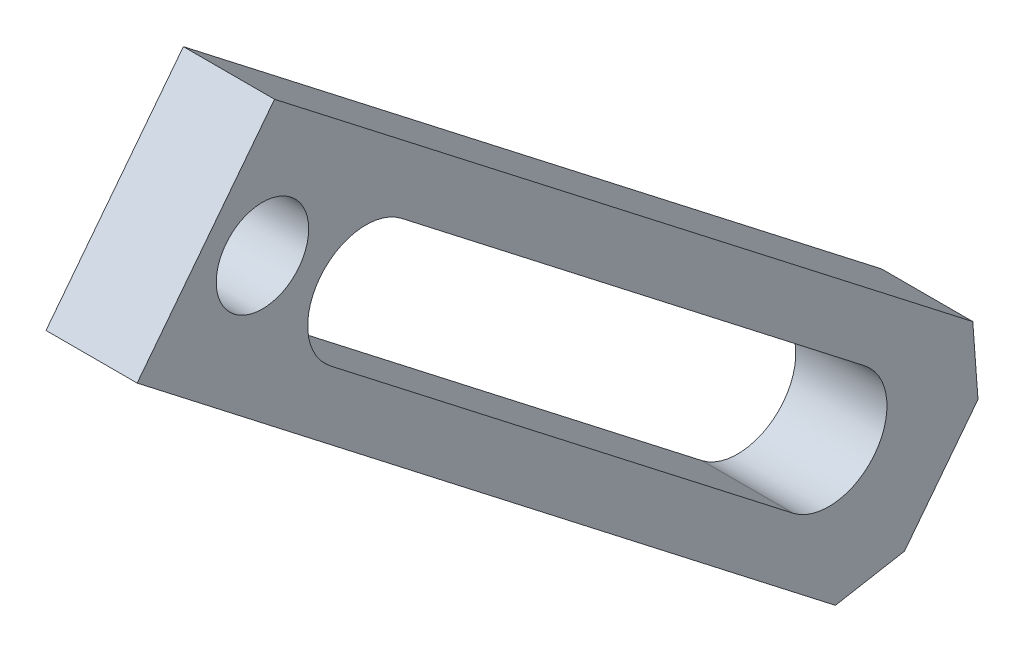
ISO-10303-21;
HEADER;
FILE_DESCRIPTION(('STEP AP214'),'2;1');
FILE_NAME('part.step','',(''),(''),'','','');
FILE_SCHEMA(('AUTOMOTIVE_DESIGN { 1 0 10303 214 1 1 1 1 }'));
ENDSEC;
DATA;
#1=APPLICATION_CONTEXT('core data for automotive mechanical design processes');
#2=APPLICATION_PROTOCOL_DEFINITION('international standard','automotive_design',2000,#1);
#3=PRODUCT_CONTEXT('',#1,'mechanical');
#4=PRODUCT('Part','Part','',(#3));
#5=PRODUCT_RELATED_PRODUCT_CATEGORY('part','',(#4));
#6=PRODUCT_DEFINITION_FORMATION('','',#4);
#7=PRODUCT_DEFINITION_CONTEXT('part definition',#1,'design');
#8=PRODUCT_DEFINITION('design','',#6,#7);
#9=PRODUCT_DEFINITION_SHAPE('','',#8);
#10=(LENGTH_UNIT() NAMED_UNIT(*) SI_UNIT(.MILLI.,.METRE.));
#11=(NAMED_UNIT(*) PLANE_ANGLE_UNIT() SI_UNIT($,.RADIAN.));
#12=(NAMED_UNIT(*) SI_UNIT($,.STERADIAN.) SOLID_ANGLE_UNIT());
#13=UNCERTAINTY_MEASURE_WITH_UNIT(LENGTH_MEASURE(1.E-05),#10,'distance_accuracy_value','');
#14=(GEOMETRIC_REPRESENTATION_CONTEXT(3) GLOBAL_UNCERTAINTY_ASSIGNED_CONTEXT((#13)) GLOBAL_UNIT_ASSIGNED_CONTEXT((#10,
#11,#12)) REPRESENTATION_CONTEXT('',''));
#15=CARTESIAN_POINT('',(0.,0.,0.));
#16=DIRECTION('',(0.,0.,1.));
#17=DIRECTION('',(1.,0.,0.));
#18=AXIS2_PLACEMENT_3D('',#15,#16,#17);
#19=CARTESIAN_POINT('',(-15.972282,3.542538,-376.003566));
#20=DIRECTION('',(0.,-0.790155249608492,0.612906747814169));
#21=DIRECTION('',(0.,-0.612906747814169,-0.790155249608492));
#22=AXIS2_PLACEMENT_3D('',#19,#20,#21);
#23=PLANE('',#22);
#24=DIRECTION('',(0.,-0.612906747814169,-0.790155249608492));
#25=VECTOR('',#24,1.);
#26=CARTESIAN_POINT('',(0.,3.542538,-376.003566));
#27=LINE('',#26,#25);
#28=CARTESIAN_POINT('',(0.,98.434652,-253.669292));
#29=VERTEX_POINT('',#28);
#30=CARTESIAN_POINT('',(0.,3.542538,-376.003566));
#31=VERTEX_POINT('',#30);
#32=EDGE_CURVE('E153',#29,#31,#27,.T.);
#33=ORIENTED_EDGE('',*,*,#32,.F.);
#34=DIRECTION('',(1.,0.,0.));
#35=VECTOR('',#34,1.);
#36=CARTESIAN_POINT('',(-15.972282,98.434652,-253.669292));
#37=LINE('',#36,#35);
#38=CARTESIAN_POINT('',(-15.972282,98.434652,-253.669292));
#39=VERTEX_POINT('',#38);
#40=EDGE_CURVE('E11',#39,#29,#37,.T.);
#41=ORIENTED_EDGE('',*,*,#40,.F.);
#42=DIRECTION('',(0.,-0.612906747814169,-0.790155249608492));
#43=VECTOR('',#42,1.);
#44=CARTESIAN_POINT('',(-15.972282,3.542538,-376.003566));
#45=LINE('',#44,#43);
#46=CARTESIAN_POINT('',(-15.972282,3.542538,-376.003566));
#47=VERTEX_POINT('',#46);
#48=EDGE_CURVE('E157',#39,#47,#45,.T.);
#49=ORIENTED_EDGE('',*,*,#48,.T.);
#50=DIRECTION('',(1.,0.,0.));
#51=VECTOR('',#50,1.);
#52=CARTESIAN_POINT('',(-15.972282,3.542538,-376.003566));
#53=LINE('',#52,#51);
#54=EDGE_CURVE('E36',#47,#31,#53,.T.);
#55=ORIENTED_EDGE('',*,*,#54,.T.);
#56=EDGE_LOOP('',(#33,#41,#49,#55));
#57=FACE_BOUND('',#56,.T.);
#58=ADVANCED_FACE('F33',(#57),#23,.T.);
#59=CARTESIAN_POINT('',(-15.972282,98.434652,-253.669292));
#60=DIRECTION('',(0.,0.612910640460421,0.790152230149606));
#61=DIRECTION('',(0.,-0.790152230149606,0.612910640460421));
#62=AXIS2_PLACEMENT_3D('',#59,#60,#61);
#63=PLANE('',#62);
#64=DIRECTION('',(0.,-0.790152230149606,0.612910640460421));
#65=VECTOR('',#64,1.);
#66=CARTESIAN_POINT('',(0.,98.434652,-253.669292));
#67=LINE('',#66,#65);
#68=CARTESIAN_POINT('',(0.,129.464308,-277.738586));
#69=VERTEX_POINT('',#68);
#70=EDGE_CURVE('E161',#69,#29,#67,.T.);
#71=ORIENTED_EDGE('',*,*,#70,.F.);
#72=DIRECTION('',(1.,0.,0.));
#73=VECTOR('',#72,1.);
#74=CARTESIAN_POINT('',(-15.972282,129.464308,-277.738586));
#75=LINE('',#74,#73);
#76=CARTESIAN_POINT('',(-15.972282,129.464308,-277.738586));
#77=VERTEX_POINT('',#76);
#78=EDGE_CURVE('E41',#77,#69,#75,.T.);
#79=ORIENTED_EDGE('',*,*,#78,.F.);
#80=DIRECTION('',(0.,-0.790152230149606,0.612910640460421));
#81=VECTOR('',#80,1.);
#82=CARTESIAN_POINT('',(-15.972282,98.434652,-253.669292));
#83=LINE('',#82,#81);
#84=EDGE_CURVE('E176',#77,#39,#83,.T.);
#85=ORIENTED_EDGE('',*,*,#84,.T.);
#86=ORIENTED_EDGE('',*,*,#40,.T.);
#87=EDGE_LOOP('',(#71,#79,#85,#86));
#88=FACE_BOUND('',#87,.T.);
#89=ADVANCED_FACE('F218',(#88),#63,.T.);
#90=CARTESIAN_POINT('',(-15.972282,129.464308,-277.738586));
#91=DIRECTION('',(0.,0.79015604412862,-0.612905723522803));
#92=DIRECTION('',(0.,0.612905723522803,0.79015604412862));
#93=AXIS2_PLACEMENT_3D('',#90,#91,#92);
#94=PLANE('',#93);
#95=DIRECTION('',(0.,0.612905723522803,0.79015604412862));
#96=VECTOR('',#95,1.);
#97=CARTESIAN_POINT('',(0.,129.464308,-277.738586));
#98=LINE('',#97,#96);
#99=CARTESIAN_POINT('',(0.,34.572448,-400.07286));
#100=VERTEX_POINT('',#99);
#101=EDGE_CURVE('E193',#100,#69,#98,.T.);
#102=ORIENTED_EDGE('',*,*,#101,.F.);
#103=DIRECTION('',(1.,0.,0.));
#104=VECTOR('',#103,1.);
#105=CARTESIAN_POINT('',(-15.972282,34.572448,-400.07286));
#106=LINE('',#105,#104);
#107=CARTESIAN_POINT('',(-15.972282,34.572448,-400.07286));
#108=VERTEX_POINT('',#107);
#109=EDGE_CURVE('E199',#108,#100,#106,.T.);
#110=ORIENTED_EDGE('',*,*,#109,.F.);
#111=DIRECTION('',(0.,0.612905723522803,0.79015604412862));
#112=VECTOR('',#111,1.);
#113=CARTESIAN_POINT('',(-15.972282,129.464308,-277.738586));
#114=LINE('',#113,#112);
#115=EDGE_CURVE('E173',#108,#77,#114,.T.);
#116=ORIENTED_EDGE('',*,*,#115,.T.);
#117=ORIENTED_EDGE('',*,*,#78,.T.);
#118=EDGE_LOOP('',(#102,#110,#116,#117));
#119=FACE_BOUND('',#118,.T.);
#120=ADVANCED_FACE('F233',(#119),#94,.T.);
#121=CARTESIAN_POINT('',(-15.972282,34.572448,-400.07286));
#122=DIRECTION('',(0.,0.0743666186938785,-0.997230969246362));
#123=DIRECTION('',(0.,0.997230969246362,0.0743666186938785));
#124=AXIS2_PLACEMENT_3D('',#121,#122,#123);
#125=PLANE('',#124);
#126=DIRECTION('',(0.,0.997230969246362,0.0743666186938785));
#127=VECTOR('',#126,1.);
#128=CARTESIAN_POINT('',(0.,34.572448,-400.07286));
#129=LINE('',#128,#127);
#130=CARTESIAN_POINT('',(0.,22.300438,-400.988022));
#131=VERTEX_POINT('',#130);
#132=EDGE_CURVE('E190',#131,#100,#129,.T.);
#133=ORIENTED_EDGE('',*,*,#132,.F.);
#134=DIRECTION('',(1.,0.,0.));
#135=VECTOR('',#134,1.);
#136=CARTESIAN_POINT('',(-15.972282,22.300438,-400.988022));
#137=LINE('',#136,#135);
#138=CARTESIAN_POINT('',(-15.972282,22.300438,-400.988022));
#139=VERTEX_POINT('',#138);
#140=EDGE_CURVE('E201',#139,#131,#137,.T.);
#141=ORIENTED_EDGE('',*,*,#140,.F.);
#142=DIRECTION('',(0.,0.997230969246362,0.0743666186938785));
#143=VECTOR('',#142,1.);
#144=CARTESIAN_POINT('',(-15.972282,34.572448,-400.07286));
#145=LINE('',#144,#143);
#146=EDGE_CURVE('E170',#139,#108,#145,.T.);
#147=ORIENTED_EDGE('',*,*,#146,.T.);
#148=ORIENTED_EDGE('',*,*,#109,.T.);
#149=EDGE_LOOP('',(#133,#141,#147,#148));
#150=FACE_BOUND('',#149,.T.);
#151=ADVANCED_FACE('F231',(#150),#125,.T.);
#152=CARTESIAN_POINT('',(-15.972282,22.300438,-400.988022));
#153=DIRECTION('',(0.,-0.612891649591422,-0.790166960750135));
#154=DIRECTION('',(0.,0.790166960750136,-0.612891649591422));
#155=AXIS2_PLACEMENT_3D('',#152,#153,#154);
#156=PLANE('',#155);
#157=DIRECTION('',(0.,0.790166960750135,-0.612891649591422));
#158=VECTOR('',#157,1.);
#159=CARTESIAN_POINT('',(0.,22.300438,-400.988022));
#160=LINE('',#159,#158);
#161=CARTESIAN_POINT('',(0.,14.004036,-394.552932));
#162=VERTEX_POINT('',#161);
#163=EDGE_CURVE('E187',#162,#131,#160,.T.);
#164=ORIENTED_EDGE('',*,*,#163,.F.);
#165=DIRECTION('',(1.,0.,0.));
#166=VECTOR('',#165,1.);
#167=CARTESIAN_POINT('',(-15.972282,14.004036,-394.552932));
#168=LINE('',#167,#166);
#169=CARTESIAN_POINT('',(-15.972282,14.004036,-394.552932));
#170=VERTEX_POINT('',#169);
#171=EDGE_CURVE('E203',#170,#162,#168,.T.);
#172=ORIENTED_EDGE('',*,*,#171,.F.);
#173=DIRECTION('',(0.,0.790166960750135,-0.612891649591422));
#174=VECTOR('',#173,1.);
#175=CARTESIAN_POINT('',(-15.972282,22.300438,-400.988022));
#176=LINE('',#175,#174);
#177=EDGE_CURVE('E167',#170,#139,#176,.T.);
#178=ORIENTED_EDGE('',*,*,#177,.T.);
#179=ORIENTED_EDGE('',*,*,#140,.T.);
#180=EDGE_LOOP('',(#164,#172,#178,#179));
#181=FACE_BOUND('',#180,.T.);
#182=ADVANCED_FACE('F229',(#181),#156,.T.);
#183=CARTESIAN_POINT('',(-15.972282,14.004036,-394.552932));
#184=DIRECTION('',(0.,-0.612918469273223,-0.79014615738088));
#185=DIRECTION('',(0.,0.79014615738088,-0.612918469273223));
#186=AXIS2_PLACEMENT_3D('',#183,#184,#185);
#187=PLANE('',#186);
#188=DIRECTION('',(0.,0.79014615738088,-0.612918469273223));
#189=VECTOR('',#188,1.);
#190=CARTESIAN_POINT('',(0.,14.004036,-394.552932));
#191=LINE('',#190,#189);
#192=CARTESIAN_POINT('',(0.,5.707888,-388.117588));
#193=VERTEX_POINT('',#192);
#194=EDGE_CURVE('E184',#193,#162,#191,.T.);
#195=ORIENTED_EDGE('',*,*,#194,.F.);
#196=DIRECTION('',(1.,0.,0.));
#197=VECTOR('',#196,1.);
#198=CARTESIAN_POINT('',(-15.972282,5.707888,-388.117588));
#199=LINE('',#198,#197);
#200=CARTESIAN_POINT('',(-15.972282,5.707888,-388.117588));
#201=VERTEX_POINT('',#200);
#202=EDGE_CURVE('E204',#201,#193,#199,.T.);
#203=ORIENTED_EDGE('',*,*,#202,.F.);
#204=DIRECTION('',(0.,0.79014615738088,-0.612918469273223));
#205=VECTOR('',#204,1.);
#206=CARTESIAN_POINT('',(-15.972282,14.004036,-394.552932));
#207=LINE('',#206,#205);
#208=EDGE_CURVE('E164',#201,#170,#207,.T.);
#209=ORIENTED_EDGE('',*,*,#208,.T.);
#210=ORIENTED_EDGE('',*,*,#171,.T.);
#211=EDGE_LOOP('',(#195,#203,#209,#210));
#212=FACE_BOUND('',#211,.T.);
#213=ADVANCED_FACE('F225',(#212),#187,.T.);
#214=CARTESIAN_POINT('',(-15.972282,5.707888,-388.117588));
#215=DIRECTION('',(0.,-0.98439758301552,-0.175958513727535));
#216=DIRECTION('',(0.,0.175958513727535,-0.98439758301552));
#217=AXIS2_PLACEMENT_3D('',#214,#215,#216);
#218=PLANE('',#217);
#219=DIRECTION('',(0.,0.175958513727535,-0.98439758301552));
#220=VECTOR('',#219,1.);
#221=CARTESIAN_POINT('',(0.,5.707888,-388.117588));
#222=LINE('',#221,#220);
#223=EDGE_CURVE('E181',#31,#193,#222,.T.);
#224=ORIENTED_EDGE('',*,*,#223,.F.);
#225=ORIENTED_EDGE('',*,*,#54,.F.);
#226=DIRECTION('',(0.,0.175958513727535,-0.98439758301552));
#227=VECTOR('',#226,1.);
#228=CARTESIAN_POINT('',(-15.972282,5.707888,-388.117588));
#229=LINE('',#228,#227);
#230=EDGE_CURVE('E160',#47,#201,#229,.T.);
#231=ORIENTED_EDGE('',*,*,#230,.T.);
#232=ORIENTED_EDGE('',*,*,#202,.T.);
#233=EDGE_LOOP('',(#224,#225,#231,#232));
#234=FACE_BOUND('',#233,.T.);
#235=ADVANCED_FACE('F212',(#234),#218,.T.);
#236=CARTESIAN_POINT('',(-15.972282,0.,0.));
#237=DIRECTION('',(-1.,0.,0.));
#238=DIRECTION('',(0.,0.,1.));
#239=AXIS2_PLACEMENT_3D('',#236,#237,#238);
#240=PLANE('',#239);
#241=CARTESIAN_POINT('',(-15.972282,106.805984,-275.620988));
#242=DIRECTION('',(1.,0.,0.));
#243=DIRECTION('',(0.,0.,-1.));
#244=AXIS2_PLACEMENT_3D('',#241,#242,#243);
#245=CIRCLE('',#244,8.10002545624491);
#246=CARTESIAN_POINT('',(-15.972282,106.805984,-283.721013456245));
#247=VERTEX_POINT('',#246);
#248=EDGE_CURVE('E147',#247,#247,#245,.T.);
#249=ORIENTED_EDGE('',*,*,#248,.T.);
#250=EDGE_LOOP('',(#249));
#251=FACE_BOUND('',#250,.T.);
#252=CARTESIAN_POINT('',(-15.972282,92.1933068230301,-293.751835710965));
#253=DIRECTION('',(1.,0.,0.));
#254=DIRECTION('',(0.,0.,1.));
#255=AXIS2_PLACEMENT_3D('',#252,#253,#254);
#256=CIRCLE('',#255,10.2037128616926);
#257=CARTESIAN_POINT('',(-15.972282,100.255832,-300.00575));
#258=VERTEX_POINT('',#257);
#259=CARTESIAN_POINT('',(-15.972282,84.130896,-287.497774));
#260=VERTEX_POINT('',#259);
#261=EDGE_CURVE('E118',#258,#260,#256,.T.);
#262=ORIENTED_EDGE('',*,*,#261,.T.);
#263=DIRECTION('',(0.,-0.612907295855483,-0.790154824504109));
#264=VECTOR('',#263,1.);
#265=CARTESIAN_POINT('',(-15.972282,84.130896,-287.497774));
#266=LINE('',#265,#264);
#267=CARTESIAN_POINT('',(-15.972282,21.235924,-368.581432));
#268=VERTEX_POINT('',#267);
#269=EDGE_CURVE('E127',#260,#268,#266,.T.);
#270=ORIENTED_EDGE('',*,*,#269,.T.);
#271=CARTESIAN_POINT('',(-15.972282,29.2985162367476,-374.835423562365));
#272=DIRECTION('',(1.,0.,0.));
#273=DIRECTION('',(0.,0.,1.));
#274=AXIS2_PLACEMENT_3D('',#271,#272,#273);
#275=CIRCLE('',#274,10.2038132106673);
#276=CARTESIAN_POINT('',(-15.972282,37.361114,-381.089408));
#277=VERTEX_POINT('',#276);
#278=EDGE_CURVE('E49',#268,#277,#275,.T.);
#279=ORIENTED_EDGE('',*,*,#278,.T.);
#280=DIRECTION('',(0.,0.612905750465973,0.790156023229427));
#281=VECTOR('',#280,1.);
#282=CARTESIAN_POINT('',(-15.972282,100.255832,-300.00575));
#283=LINE('',#282,#281);
#284=EDGE_CURVE('E124',#277,#258,#283,.T.);
#285=ORIENTED_EDGE('',*,*,#284,.T.);
#286=EDGE_LOOP('',(#262,#270,#279,#285));
#287=FACE_BOUND('',#286,.T.);
#288=ORIENTED_EDGE('',*,*,#48,.F.);
#289=ORIENTED_EDGE('',*,*,#84,.F.);
#290=ORIENTED_EDGE('',*,*,#115,.F.);
#291=ORIENTED_EDGE('',*,*,#146,.F.);
#292=ORIENTED_EDGE('',*,*,#177,.F.);
#293=ORIENTED_EDGE('',*,*,#208,.F.);
#294=ORIENTED_EDGE('',*,*,#230,.F.);
#295=EDGE_LOOP('',(#288,#289,#290,#291,#292,#293,#294));
#296=FACE_BOUND('',#295,.T.);
#297=ADVANCED_FACE('F131',(#251,#287,#296),#240,.T.);
#298=CARTESIAN_POINT('',(0.,0.,0.));
#299=DIRECTION('',(-1.,0.,0.));
#300=DIRECTION('',(0.,0.,1.));
#301=AXIS2_PLACEMENT_3D('',#298,#299,#300);
#302=PLANE('',#301);
#303=CARTESIAN_POINT('',(0.,106.805984,-275.620988));
#304=DIRECTION('',(1.,0.,0.));
#305=DIRECTION('',(0.,0.,-1.));
#306=AXIS2_PLACEMENT_3D('',#303,#304,#305);
#307=CIRCLE('',#306,8.10002545624491);
#308=CARTESIAN_POINT('',(0.,106.805984,-283.721013456245));
#309=VERTEX_POINT('',#308);
#310=EDGE_CURVE('E140',#309,#309,#307,.T.);
#311=ORIENTED_EDGE('',*,*,#310,.F.);
#312=EDGE_LOOP('',(#311));
#313=FACE_BOUND('',#312,.T.);
#314=DIRECTION('',(0.,-0.612907295855483,-0.790154824504109));
#315=VECTOR('',#314,1.);
#316=CARTESIAN_POINT('',(0.,84.130896,-287.497774));
#317=LINE('',#316,#315);
#318=CARTESIAN_POINT('',(0.,84.130896,-287.497774));
#319=VERTEX_POINT('',#318);
#320=CARTESIAN_POINT('',(0.,21.235924,-368.581432));
#321=VERTEX_POINT('',#320);
#322=EDGE_CURVE('E146',#319,#321,#317,.T.);
#323=ORIENTED_EDGE('',*,*,#322,.F.);
#324=CARTESIAN_POINT('',(0.,92.1933068230301,-293.751835710965));
#325=DIRECTION('',(1.,0.,0.));
#326=DIRECTION('',(0.,0.,1.));
#327=AXIS2_PLACEMENT_3D('',#324,#325,#326);
#328=CIRCLE('',#327,10.2037128616926);
#329=CARTESIAN_POINT('',(0.,100.255832,-300.00575));
#330=VERTEX_POINT('',#329);
#331=EDGE_CURVE('E57',#330,#319,#328,.T.);
#332=ORIENTED_EDGE('',*,*,#331,.F.);
#333=DIRECTION('',(0.,0.612905750465973,0.790156023229427));
#334=VECTOR('',#333,1.);
#335=CARTESIAN_POINT('',(0.,100.255832,-300.00575));
#336=LINE('',#335,#334);
#337=CARTESIAN_POINT('',(0.,37.361114,-381.089408));
#338=VERTEX_POINT('',#337);
#339=EDGE_CURVE('E134',#338,#330,#336,.T.);
#340=ORIENTED_EDGE('',*,*,#339,.F.);
#341=CARTESIAN_POINT('',(0.,29.2985162367476,-374.835423562365));
#342=DIRECTION('',(1.,0.,0.));
#343=DIRECTION('',(0.,0.,1.));
#344=AXIS2_PLACEMENT_3D('',#341,#342,#343);
#345=CIRCLE('',#344,10.2038132106673);
#346=EDGE_CURVE('E137',#321,#338,#345,.T.);
#347=ORIENTED_EDGE('',*,*,#346,.F.);
#348=EDGE_LOOP('',(#323,#332,#340,#347));
#349=FACE_BOUND('',#348,.T.);
#350=ORIENTED_EDGE('',*,*,#32,.T.);
#351=ORIENTED_EDGE('',*,*,#223,.T.);
#352=ORIENTED_EDGE('',*,*,#194,.T.);
#353=ORIENTED_EDGE('',*,*,#163,.T.);
#354=ORIENTED_EDGE('',*,*,#132,.T.);
#355=ORIENTED_EDGE('',*,*,#101,.T.);
#356=ORIENTED_EDGE('',*,*,#70,.T.);
#357=EDGE_LOOP('',(#350,#351,#352,#353,#354,#355,#356));
#358=FACE_BOUND('',#357,.T.);
#359=ADVANCED_FACE('F214',(#313,#349,#358),#302,.F.);
#360=CARTESIAN_POINT('',(-15.972282,92.1933068230301,-293.751835710965));
#361=DIRECTION('',(1.,0.,0.));
#362=DIRECTION('',(0.,0.,-1.));
#363=AXIS2_PLACEMENT_3D('',#360,#361,#362);
#364=CYLINDRICAL_SURFACE('',#363,10.2037128616926);
#365=ORIENTED_EDGE('',*,*,#331,.T.);
#366=DIRECTION('',(1.,0.,0.));
#367=VECTOR('',#366,1.);
#368=CARTESIAN_POINT('',(-15.972282,84.130896,-287.497774));
#369=LINE('',#368,#367);
#370=EDGE_CURVE('E114',#260,#319,#369,.T.);
#371=ORIENTED_EDGE('',*,*,#370,.F.);
#372=ORIENTED_EDGE('',*,*,#261,.F.);
#373=DIRECTION('',(1.,0.,0.));
#374=VECTOR('',#373,1.);
#375=CARTESIAN_POINT('',(-15.972282,100.255832,-300.00575));
#376=LINE('',#375,#374);
#377=EDGE_CURVE('E151',#258,#330,#376,.T.);
#378=ORIENTED_EDGE('',*,*,#377,.T.);
#379=EDGE_LOOP('',(#365,#371,#372,#378));
#380=FACE_BOUND('',#379,.T.);
#381=ADVANCED_FACE('F116',(#380),#364,.F.);
#382=CARTESIAN_POINT('',(-15.972282,100.255832,-300.00575));
#383=DIRECTION('',(0.,0.790156023229427,-0.612905750465973));
#384=DIRECTION('',(0.,0.612905750465973,0.790156023229427));
#385=AXIS2_PLACEMENT_3D('',#382,#383,#384);
#386=PLANE('',#385);
#387=ORIENTED_EDGE('',*,*,#339,.T.);
#388=ORIENTED_EDGE('',*,*,#377,.F.);
#389=ORIENTED_EDGE('',*,*,#284,.F.);
#390=DIRECTION('',(1.,0.,0.));
#391=VECTOR('',#390,1.);
#392=CARTESIAN_POINT('',(-15.972282,37.361114,-381.089408));
#393=LINE('',#392,#391);
#394=EDGE_CURVE('E154',#277,#338,#393,.T.);
#395=ORIENTED_EDGE('',*,*,#394,.T.);
#396=EDGE_LOOP('',(#387,#388,#389,#395));
#397=FACE_BOUND('',#396,.T.);
#398=ADVANCED_FACE('F309',(#397),#386,.F.);
#399=CARTESIAN_POINT('',(-15.972282,29.2985162367476,-374.835423562365));
#400=DIRECTION('',(1.,0.,0.));
#401=DIRECTION('',(0.,0.,-1.));
#402=AXIS2_PLACEMENT_3D('',#399,#400,#401);
#403=CYLINDRICAL_SURFACE('',#402,10.2038132106673);
#404=ORIENTED_EDGE('',*,*,#346,.T.);
#405=ORIENTED_EDGE('',*,*,#394,.F.);
#406=ORIENTED_EDGE('',*,*,#278,.F.);
#407=DIRECTION('',(1.,0.,0.));
#408=VECTOR('',#407,1.);
#409=CARTESIAN_POINT('',(-15.972282,21.235924,-368.581432));
#410=LINE('',#409,#408);
#411=EDGE_CURVE('E123',#268,#321,#410,.T.);
#412=ORIENTED_EDGE('',*,*,#411,.T.);
#413=EDGE_LOOP('',(#404,#405,#406,#412));
#414=FACE_BOUND('',#413,.T.);
#415=ADVANCED_FACE('F318',(#414),#403,.F.);
#416=CARTESIAN_POINT('',(-15.972282,84.130896,-287.497774));
#417=DIRECTION('',(0.,-0.790154824504109,0.612907295855483));
#418=DIRECTION('',(0.,-0.612907295855483,-0.790154824504109));
#419=AXIS2_PLACEMENT_3D('',#416,#417,#418);
#420=PLANE('',#419);
#421=ORIENTED_EDGE('',*,*,#322,.T.);
#422=ORIENTED_EDGE('',*,*,#411,.F.);
#423=ORIENTED_EDGE('',*,*,#269,.F.);
#424=ORIENTED_EDGE('',*,*,#370,.T.);
#425=EDGE_LOOP('',(#421,#422,#423,#424));
#426=FACE_BOUND('',#425,.T.);
#427=ADVANCED_FACE('F128',(#426),#420,.F.);
#428=CARTESIAN_POINT('',(-15.972282,106.805984,-275.620988));
#429=DIRECTION('',(1.,0.,0.));
#430=DIRECTION('',(0.,0.,-1.));
#431=AXIS2_PLACEMENT_3D('',#428,#429,#430);
#432=CYLINDRICAL_SURFACE('',#431,8.10002545624491);
#433=ORIENTED_EDGE('',*,*,#248,.F.);
#434=EDGE_LOOP('',(#433));
#435=FACE_BOUND('',#434,.T.);
#436=ORIENTED_EDGE('',*,*,#310,.T.);
#437=EDGE_LOOP('',(#436));
#438=FACE_BOUND('',#437,.T.);
#439=ADVANCED_FACE('F336',(#435,#438),#432,.F.);
#440=CLOSED_SHELL('',(#58,#89,#120,#151,#182,#213,#235,#297,#359,#381,#398,#415,#427,#439));
#441=MANIFOLD_SOLID_BREP('B2',#440);
#442=ADVANCED_BREP_SHAPE_REPRESENTATION('',(#18,#441),#14);
#443=SHAPE_DEFINITION_REPRESENTATION(#9,#442);
ENDSEC;
END-ISO-10303-21;
